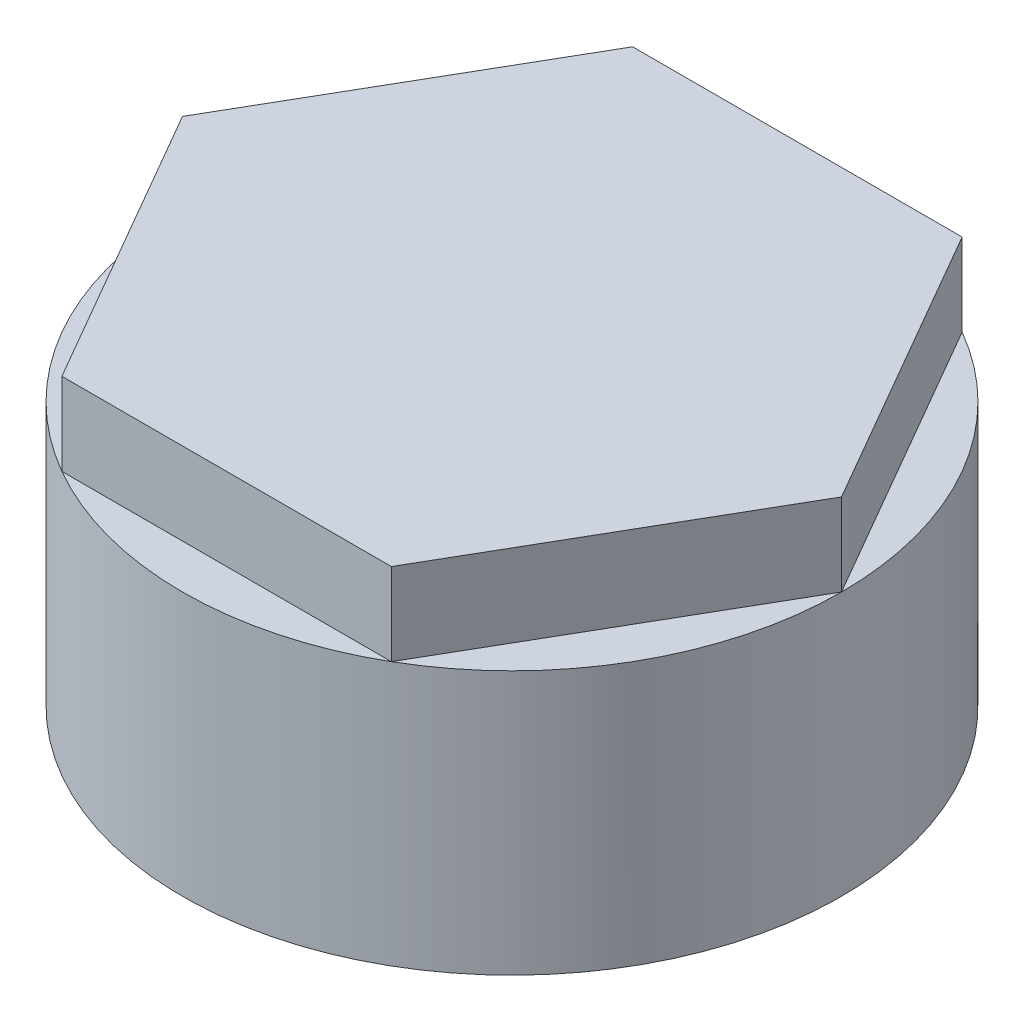
ISO-10303-21;
HEADER;
FILE_DESCRIPTION(('STEP AP214'),'2;1');
FILE_NAME('part.step','',(''),(''),'','','');
FILE_SCHEMA(('AUTOMOTIVE_DESIGN { 1 0 10303 214 1 1 1 1 }'));
ENDSEC;
DATA;
#1=APPLICATION_CONTEXT('core data for automotive mechanical design processes');
#2=APPLICATION_PROTOCOL_DEFINITION('international standard','automotive_design',2000,#1);
#3=PRODUCT_CONTEXT('',#1,'mechanical');
#4=PRODUCT('Part','Part','',(#3));
#5=PRODUCT_RELATED_PRODUCT_CATEGORY('part','',(#4));
#6=PRODUCT_DEFINITION_FORMATION('','',#4);
#7=PRODUCT_DEFINITION_CONTEXT('part definition',#1,'design');
#8=PRODUCT_DEFINITION('design','',#6,#7);
#9=PRODUCT_DEFINITION_SHAPE('','',#8);
#10=(LENGTH_UNIT() NAMED_UNIT(*) SI_UNIT(.MILLI.,.METRE.));
#11=(NAMED_UNIT(*) PLANE_ANGLE_UNIT() SI_UNIT($,.RADIAN.));
#12=(NAMED_UNIT(*) SI_UNIT($,.STERADIAN.) SOLID_ANGLE_UNIT());
#13=UNCERTAINTY_MEASURE_WITH_UNIT(LENGTH_MEASURE(1.E-05),#10,'distance_accuracy_value','');
#14=(GEOMETRIC_REPRESENTATION_CONTEXT(3) GLOBAL_UNCERTAINTY_ASSIGNED_CONTEXT((#13)) GLOBAL_UNIT_ASSIGNED_CONTEXT((#10,
#11,#12)) REPRESENTATION_CONTEXT('',''));
#15=CARTESIAN_POINT('',(0.,0.,0.));
#16=DIRECTION('',(0.,0.,1.));
#17=DIRECTION('',(1.,0.,0.));
#18=AXIS2_PLACEMENT_3D('',#15,#16,#17);
#19=CARTESIAN_POINT('',(0.,0.,0.));
#20=DIRECTION('',(0.,-1.,0.));
#21=DIRECTION('',(0.,0.,-1.));
#22=AXIS2_PLACEMENT_3D('',#19,#20,#21);
#23=CYLINDRICAL_SURFACE('',#22,20.);
#24=CARTESIAN_POINT('',(0.,0.,0.));
#25=DIRECTION('',(0.,-1.,0.));
#26=DIRECTION('',(0.,0.,-1.));
#27=AXIS2_PLACEMENT_3D('',#24,#25,#26);
#28=CIRCLE('',#27,20.);
#29=CARTESIAN_POINT('',(0.,0.,-20.));
#30=VERTEX_POINT('',#29);
#31=EDGE_CURVE('E128',#30,#30,#28,.T.);
#32=ORIENTED_EDGE('',*,*,#31,.F.);
#33=EDGE_LOOP('',(#32));
#34=FACE_BOUND('',#33,.T.);
#35=CARTESIAN_POINT('',(0.,16.,0.));
#36=DIRECTION('',(0.,1.,0.));
#37=DIRECTION('',(0.,0.,1.));
#38=AXIS2_PLACEMENT_3D('',#35,#36,#37);
#39=CIRCLE('',#38,20.);
#40=CARTESIAN_POINT('',(10.,16.,-17.3205080756888));
#41=VERTEX_POINT('',#40);
#42=CARTESIAN_POINT('',(-10.,16.,-17.3205080756888));
#43=VERTEX_POINT('',#42);
#44=EDGE_CURVE('E94',#41,#43,#39,.T.);
#45=ORIENTED_EDGE('',*,*,#44,.F.);
#46=CARTESIAN_POINT('',(0.,16.,0.));
#47=DIRECTION('',(0.,1.,0.));
#48=DIRECTION('',(0.,0.,1.));
#49=AXIS2_PLACEMENT_3D('',#46,#47,#48);
#50=CIRCLE('',#49,20.);
#51=CARTESIAN_POINT('',(20.,16.,0.));
#52=VERTEX_POINT('',#51);
#53=EDGE_CURVE('E331',#52,#41,#50,.T.);
#54=ORIENTED_EDGE('',*,*,#53,.F.);
#55=CARTESIAN_POINT('',(0.,16.,0.));
#56=DIRECTION('',(0.,1.,0.));
#57=DIRECTION('',(0.,0.,1.));
#58=AXIS2_PLACEMENT_3D('',#55,#56,#57);
#59=CIRCLE('',#58,20.);
#60=CARTESIAN_POINT('',(10.,16.,17.3205080756888));
#61=VERTEX_POINT('',#60);
#62=EDGE_CURVE('E325',#61,#52,#59,.T.);
#63=ORIENTED_EDGE('',*,*,#62,.F.);
#64=CARTESIAN_POINT('',(0.,16.,0.));
#65=DIRECTION('',(0.,1.,0.));
#66=DIRECTION('',(0.,0.,1.));
#67=AXIS2_PLACEMENT_3D('',#64,#65,#66);
#68=CIRCLE('',#67,20.);
#69=CARTESIAN_POINT('',(-10.,16.,17.3205080756888));
#70=VERTEX_POINT('',#69);
#71=EDGE_CURVE('E140',#70,#61,#68,.T.);
#72=ORIENTED_EDGE('',*,*,#71,.F.);
#73=CARTESIAN_POINT('',(0.,16.,0.));
#74=DIRECTION('',(0.,1.,0.));
#75=DIRECTION('',(0.,0.,1.));
#76=AXIS2_PLACEMENT_3D('',#73,#74,#75);
#77=CIRCLE('',#76,20.);
#78=CARTESIAN_POINT('',(-20.,16.,0.));
#79=VERTEX_POINT('',#78);
#80=EDGE_CURVE('E132',#79,#70,#77,.T.);
#81=ORIENTED_EDGE('',*,*,#80,.F.);
#82=CARTESIAN_POINT('',(0.,16.,0.));
#83=DIRECTION('',(0.,1.,0.));
#84=DIRECTION('',(0.,0.,1.));
#85=AXIS2_PLACEMENT_3D('',#82,#83,#84);
#86=CIRCLE('',#85,20.);
#87=EDGE_CURVE('E119',#43,#79,#86,.T.);
#88=ORIENTED_EDGE('',*,*,#87,.F.);
#89=EDGE_LOOP('',(#45,#54,#63,#72,#81,#88));
#90=FACE_BOUND('',#89,.T.);
#91=ADVANCED_FACE('F41',(#34,#90),#23,.T.);
#92=CARTESIAN_POINT('',(-20.,0.,0.));
#93=DIRECTION('',(0.,1.,0.));
#94=DIRECTION('',(0.,0.,1.));
#95=AXIS2_PLACEMENT_3D('',#92,#93,#94);
#96=PLANE('',#95);
#97=CARTESIAN_POINT('',(0.,0.,0.));
#98=DIRECTION('',(0.,-1.,0.));
#99=DIRECTION('',(0.,0.,-1.));
#100=AXIS2_PLACEMENT_3D('',#97,#98,#99);
#101=CIRCLE('',#100,15.5465);
#102=CARTESIAN_POINT('',(0.,0.,-15.5465));
#103=VERTEX_POINT('',#102);
#104=EDGE_CURVE('E11',#103,#103,#101,.T.);
#105=ORIENTED_EDGE('',*,*,#104,.F.);
#106=EDGE_LOOP('',(#105));
#107=FACE_BOUND('',#106,.T.);
#108=ORIENTED_EDGE('',*,*,#31,.T.);
#109=EDGE_LOOP('',(#108));
#110=FACE_BOUND('',#109,.T.);
#111=ADVANCED_FACE('F43',(#107,#110),#96,.F.);
#112=CARTESIAN_POINT('',(0.,0.,0.));
#113=DIRECTION('',(0.,-1.,0.));
#114=DIRECTION('',(0.,0.,-1.));
#115=AXIS2_PLACEMENT_3D('',#112,#113,#114);
#116=CYLINDRICAL_SURFACE('',#115,15.5465);
#117=CARTESIAN_POINT('',(0.,15.,0.));
#118=DIRECTION('',(0.,-1.,0.));
#119=DIRECTION('',(0.,0.,-1.));
#120=AXIS2_PLACEMENT_3D('',#117,#118,#119);
#121=CIRCLE('',#120,15.5465);
#122=CARTESIAN_POINT('',(0.,15.,-15.5465));
#123=VERTEX_POINT('',#122);
#124=EDGE_CURVE('E49',#123,#123,#121,.T.);
#125=ORIENTED_EDGE('',*,*,#124,.F.);
#126=EDGE_LOOP('',(#125));
#127=FACE_BOUND('',#126,.T.);
#128=ORIENTED_EDGE('',*,*,#104,.T.);
#129=EDGE_LOOP('',(#128));
#130=FACE_BOUND('',#129,.T.);
#131=ADVANCED_FACE('F157',(#127,#130),#116,.F.);
#132=CARTESIAN_POINT('',(-15.5465,15.,0.));
#133=DIRECTION('',(0.,1.,0.));
#134=DIRECTION('',(0.,0.,1.));
#135=AXIS2_PLACEMENT_3D('',#132,#133,#134);
#136=PLANE('',#135);
#137=ORIENTED_EDGE('',*,*,#124,.T.);
#138=EDGE_LOOP('',(#137));
#139=FACE_BOUND('',#138,.T.);
#140=ADVANCED_FACE('F155',(#139),#136,.F.);
#141=CARTESIAN_POINT('',(0.,21.,0.));
#142=DIRECTION('',(0.,-1.,0.));
#143=DIRECTION('',(0.,0.,-1.));
#144=AXIS2_PLACEMENT_3D('',#141,#142,#143);
#145=PLANE('',#144);
#146=DIRECTION('',(0.5,0.,0.866025403784439));
#147=VECTOR('',#146,1.);
#148=CARTESIAN_POINT('',(15.,21.,-8.66025403784439));
#149=LINE('',#148,#147);
#150=CARTESIAN_POINT('',(10.,21.,-17.3205080756888));
#151=VERTEX_POINT('',#150);
#152=CARTESIAN_POINT('',(20.,21.,0.));
#153=VERTEX_POINT('',#152);
#154=EDGE_CURVE('E336',#151,#153,#149,.T.);
#155=ORIENTED_EDGE('',*,*,#154,.F.);
#156=DIRECTION('',(1.,0.,0.));
#157=VECTOR('',#156,1.);
#158=CARTESIAN_POINT('',(0.,21.,-17.3205080756888));
#159=LINE('',#158,#157);
#160=CARTESIAN_POINT('',(-10.,21.,-17.3205080756888));
#161=VERTEX_POINT('',#160);
#162=EDGE_CURVE('E102',#161,#151,#159,.T.);
#163=ORIENTED_EDGE('',*,*,#162,.F.);
#164=DIRECTION('',(0.5,0.,-0.866025403784439));
#165=VECTOR('',#164,1.);
#166=CARTESIAN_POINT('',(-15.,21.,-8.66025403784439));
#167=LINE('',#166,#165);
#168=CARTESIAN_POINT('',(-20.,21.,0.));
#169=VERTEX_POINT('',#168);
#170=EDGE_CURVE('E127',#169,#161,#167,.T.);
#171=ORIENTED_EDGE('',*,*,#170,.F.);
#172=DIRECTION('',(-0.5,0.,-0.866025403784439));
#173=VECTOR('',#172,1.);
#174=CARTESIAN_POINT('',(-15.,21.,8.66025403784439));
#175=LINE('',#174,#173);
#176=CARTESIAN_POINT('',(-10.,21.,17.3205080756888));
#177=VERTEX_POINT('',#176);
#178=EDGE_CURVE('E338',#177,#169,#175,.T.);
#179=ORIENTED_EDGE('',*,*,#178,.F.);
#180=DIRECTION('',(-1.,0.,0.));
#181=VECTOR('',#180,1.);
#182=CARTESIAN_POINT('',(0.,21.,17.3205080756888));
#183=LINE('',#182,#181);
#184=CARTESIAN_POINT('',(10.,21.,17.3205080756888));
#185=VERTEX_POINT('',#184);
#186=EDGE_CURVE('E144',#185,#177,#183,.T.);
#187=ORIENTED_EDGE('',*,*,#186,.F.);
#188=DIRECTION('',(-0.5,0.,0.866025403784439));
#189=VECTOR('',#188,1.);
#190=CARTESIAN_POINT('',(15.,21.,8.66025403784439));
#191=LINE('',#190,#189);
#192=EDGE_CURVE('E112',#153,#185,#191,.T.);
#193=ORIENTED_EDGE('',*,*,#192,.F.);
#194=EDGE_LOOP('',(#155,#163,#171,#179,#187,#193));
#195=FACE_BOUND('',#194,.T.);
#196=ADVANCED_FACE('F174',(#195),#145,.F.);
#197=CARTESIAN_POINT('',(-15.,16.,-8.66025403784439));
#198=DIRECTION('',(0.866025403784439,0.,0.5));
#199=DIRECTION('',(0.5,0.,-0.866025403784439));
#200=AXIS2_PLACEMENT_3D('',#197,#198,#199);
#201=PLANE('',#200);
#202=ORIENTED_EDGE('',*,*,#170,.T.);
#203=DIRECTION('',(0.,1.,0.));
#204=VECTOR('',#203,1.);
#205=CARTESIAN_POINT('',(-10.,16.,-17.3205080756888));
#206=LINE('',#205,#204);
#207=EDGE_CURVE('E108',#43,#161,#206,.T.);
#208=ORIENTED_EDGE('',*,*,#207,.F.);
#209=DIRECTION('',(0.5,0.,-0.866025403784439));
#210=VECTOR('',#209,1.);
#211=CARTESIAN_POINT('',(-15.,16.,-8.66025403784439));
#212=LINE('',#211,#210);
#213=EDGE_CURVE('E117',#79,#43,#212,.T.);
#214=ORIENTED_EDGE('',*,*,#213,.F.);
#215=DIRECTION('',(0.,1.,0.));
#216=VECTOR('',#215,1.);
#217=CARTESIAN_POINT('',(-20.,16.,0.));
#218=LINE('',#217,#216);
#219=EDGE_CURVE('E122',#79,#169,#218,.T.);
#220=ORIENTED_EDGE('',*,*,#219,.T.);
#221=EDGE_LOOP('',(#202,#208,#214,#220));
#222=FACE_BOUND('',#221,.T.);
#223=ADVANCED_FACE('F125',(#222),#201,.F.);
#224=CARTESIAN_POINT('',(0.,16.,0.));
#225=DIRECTION('',(0.,1.,0.));
#226=DIRECTION('',(0.,0.,1.));
#227=AXIS2_PLACEMENT_3D('',#224,#225,#226);
#228=PLANE('',#227);
#229=ORIENTED_EDGE('',*,*,#87,.T.);
#230=ORIENTED_EDGE('',*,*,#213,.T.);
#231=EDGE_LOOP('',(#229,#230));
#232=FACE_BOUND('',#231,.T.);
#233=ADVANCED_FACE('F118',(#232),#228,.T.);
#234=CARTESIAN_POINT('',(0.,16.,17.3205080756888));
#235=DIRECTION('',(0.,0.,-1.));
#236=DIRECTION('',(-1.,0.,0.));
#237=AXIS2_PLACEMENT_3D('',#234,#235,#236);
#238=PLANE('',#237);
#239=ORIENTED_EDGE('',*,*,#186,.T.);
#240=DIRECTION('',(0.,1.,0.));
#241=VECTOR('',#240,1.);
#242=CARTESIAN_POINT('',(-10.,16.,17.3205080756888));
#243=LINE('',#242,#241);
#244=EDGE_CURVE('E341',#70,#177,#243,.T.);
#245=ORIENTED_EDGE('',*,*,#244,.F.);
#246=DIRECTION('',(-1.,0.,0.));
#247=VECTOR('',#246,1.);
#248=CARTESIAN_POINT('',(0.,16.,17.3205080756888));
#249=LINE('',#248,#247);
#250=EDGE_CURVE('E143',#61,#70,#249,.T.);
#251=ORIENTED_EDGE('',*,*,#250,.F.);
#252=DIRECTION('',(0.,1.,0.));
#253=VECTOR('',#252,1.);
#254=CARTESIAN_POINT('',(10.,16.,17.3205080756888));
#255=LINE('',#254,#253);
#256=EDGE_CURVE('E134',#61,#185,#255,.T.);
#257=ORIENTED_EDGE('',*,*,#256,.T.);
#258=EDGE_LOOP('',(#239,#245,#251,#257));
#259=FACE_BOUND('',#258,.T.);
#260=ADVANCED_FACE('F172',(#259),#238,.F.);
#261=CARTESIAN_POINT('',(0.,16.,0.));
#262=DIRECTION('',(0.,1.,0.));
#263=DIRECTION('',(0.,0.,1.));
#264=AXIS2_PLACEMENT_3D('',#261,#262,#263);
#265=PLANE('',#264);
#266=ORIENTED_EDGE('',*,*,#71,.T.);
#267=ORIENTED_EDGE('',*,*,#250,.T.);
#268=EDGE_LOOP('',(#266,#267));
#269=FACE_BOUND('',#268,.T.);
#270=ADVANCED_FACE('F206',(#269),#265,.T.);
#271=CARTESIAN_POINT('',(15.,16.,-8.66025403784439));
#272=DIRECTION('',(-0.866025403784439,0.,0.5));
#273=DIRECTION('',(0.5,0.,0.866025403784439));
#274=AXIS2_PLACEMENT_3D('',#271,#272,#273);
#275=PLANE('',#274);
#276=ORIENTED_EDGE('',*,*,#154,.T.);
#277=DIRECTION('',(0.,1.,0.));
#278=VECTOR('',#277,1.);
#279=CARTESIAN_POINT('',(20.,16.,0.));
#280=LINE('',#279,#278);
#281=EDGE_CURVE('E334',#52,#153,#280,.T.);
#282=ORIENTED_EDGE('',*,*,#281,.F.);
#283=DIRECTION('',(0.5,0.,0.866025403784439));
#284=VECTOR('',#283,1.);
#285=CARTESIAN_POINT('',(15.,16.,-8.66025403784439));
#286=LINE('',#285,#284);
#287=EDGE_CURVE('E329',#41,#52,#286,.T.);
#288=ORIENTED_EDGE('',*,*,#287,.F.);
#289=DIRECTION('',(0.,1.,0.));
#290=VECTOR('',#289,1.);
#291=CARTESIAN_POINT('',(10.,16.,-17.3205080756888));
#292=LINE('',#291,#290);
#293=EDGE_CURVE('E111',#41,#151,#292,.T.);
#294=ORIENTED_EDGE('',*,*,#293,.T.);
#295=EDGE_LOOP('',(#276,#282,#288,#294));
#296=FACE_BOUND('',#295,.T.);
#297=ADVANCED_FACE('F213',(#296),#275,.F.);
#298=CARTESIAN_POINT('',(0.,16.,0.));
#299=DIRECTION('',(0.,1.,0.));
#300=DIRECTION('',(0.,0.,1.));
#301=AXIS2_PLACEMENT_3D('',#298,#299,#300);
#302=PLANE('',#301);
#303=ORIENTED_EDGE('',*,*,#53,.T.);
#304=ORIENTED_EDGE('',*,*,#287,.T.);
#305=EDGE_LOOP('',(#303,#304));
#306=FACE_BOUND('',#305,.T.);
#307=ADVANCED_FACE('F220',(#306),#302,.T.);
#308=CARTESIAN_POINT('',(-15.,16.,8.66025403784439));
#309=DIRECTION('',(0.866025403784439,0.,-0.5));
#310=DIRECTION('',(-0.5,0.,-0.866025403784439));
#311=AXIS2_PLACEMENT_3D('',#308,#309,#310);
#312=PLANE('',#311);
#313=ORIENTED_EDGE('',*,*,#178,.T.);
#314=ORIENTED_EDGE('',*,*,#219,.F.);
#315=DIRECTION('',(-0.5,0.,-0.866025403784439));
#316=VECTOR('',#315,1.);
#317=CARTESIAN_POINT('',(-15.,16.,8.66025403784439));
#318=LINE('',#317,#316);
#319=EDGE_CURVE('E64',#70,#79,#318,.T.);
#320=ORIENTED_EDGE('',*,*,#319,.F.);
#321=ORIENTED_EDGE('',*,*,#244,.T.);
#322=EDGE_LOOP('',(#313,#314,#320,#321));
#323=FACE_BOUND('',#322,.T.);
#324=ADVANCED_FACE('F228',(#323),#312,.F.);
#325=CARTESIAN_POINT('',(0.,16.,0.));
#326=DIRECTION('',(0.,1.,0.));
#327=DIRECTION('',(0.,0.,1.));
#328=AXIS2_PLACEMENT_3D('',#325,#326,#327);
#329=PLANE('',#328);
#330=ORIENTED_EDGE('',*,*,#80,.T.);
#331=ORIENTED_EDGE('',*,*,#319,.T.);
#332=EDGE_LOOP('',(#330,#331));
#333=FACE_BOUND('',#332,.T.);
#334=ADVANCED_FACE('F236',(#333),#329,.T.);
#335=CARTESIAN_POINT('',(15.,16.,8.66025403784439));
#336=DIRECTION('',(-0.866025403784439,0.,-0.5));
#337=DIRECTION('',(-0.5,0.,0.866025403784439));
#338=AXIS2_PLACEMENT_3D('',#335,#336,#337);
#339=PLANE('',#338);
#340=ORIENTED_EDGE('',*,*,#192,.T.);
#341=ORIENTED_EDGE('',*,*,#256,.F.);
#342=DIRECTION('',(-0.5,0.,0.866025403784439));
#343=VECTOR('',#342,1.);
#344=CARTESIAN_POINT('',(15.,16.,8.66025403784439));
#345=LINE('',#344,#343);
#346=EDGE_CURVE('E56',#52,#61,#345,.T.);
#347=ORIENTED_EDGE('',*,*,#346,.F.);
#348=ORIENTED_EDGE('',*,*,#281,.T.);
#349=EDGE_LOOP('',(#340,#341,#347,#348));
#350=FACE_BOUND('',#349,.T.);
#351=ADVANCED_FACE('F243',(#350),#339,.F.);
#352=CARTESIAN_POINT('',(0.,16.,0.));
#353=DIRECTION('',(0.,1.,0.));
#354=DIRECTION('',(0.,0.,1.));
#355=AXIS2_PLACEMENT_3D('',#352,#353,#354);
#356=PLANE('',#355);
#357=ORIENTED_EDGE('',*,*,#62,.T.);
#358=ORIENTED_EDGE('',*,*,#346,.T.);
#359=EDGE_LOOP('',(#357,#358));
#360=FACE_BOUND('',#359,.T.);
#361=ADVANCED_FACE('F251',(#360),#356,.T.);
#362=CARTESIAN_POINT('',(0.,16.,-17.3205080756888));
#363=DIRECTION('',(0.,0.,1.));
#364=DIRECTION('',(1.,0.,0.));
#365=AXIS2_PLACEMENT_3D('',#362,#363,#364);
#366=PLANE('',#365);
#367=ORIENTED_EDGE('',*,*,#162,.T.);
#368=ORIENTED_EDGE('',*,*,#293,.F.);
#369=DIRECTION('',(1.,0.,0.));
#370=VECTOR('',#369,1.);
#371=CARTESIAN_POINT('',(0.,16.,-17.3205080756888));
#372=LINE('',#371,#370);
#373=EDGE_CURVE('E97',#43,#41,#372,.T.);
#374=ORIENTED_EDGE('',*,*,#373,.F.);
#375=ORIENTED_EDGE('',*,*,#207,.T.);
#376=EDGE_LOOP('',(#367,#368,#374,#375));
#377=FACE_BOUND('',#376,.T.);
#378=ADVANCED_FACE('F106',(#377),#366,.F.);
#379=CARTESIAN_POINT('',(0.,16.,0.));
#380=DIRECTION('',(0.,1.,0.));
#381=DIRECTION('',(0.,0.,1.));
#382=AXIS2_PLACEMENT_3D('',#379,#380,#381);
#383=PLANE('',#382);
#384=ORIENTED_EDGE('',*,*,#44,.T.);
#385=ORIENTED_EDGE('',*,*,#373,.T.);
#386=EDGE_LOOP('',(#384,#385));
#387=FACE_BOUND('',#386,.T.);
#388=ADVANCED_FACE('F96',(#387),#383,.T.);
#389=CLOSED_SHELL('',(#91,#111,#131,#140,#196,#223,#233,#260,#270,#297,#307,#324,#334,#351,#361,
#378,#388));
#390=MANIFOLD_SOLID_BREP('B2',#389);
#391=ADVANCED_BREP_SHAPE_REPRESENTATION('',(#18,#390),#14);
#392=SHAPE_DEFINITION_REPRESENTATION(#9,#391);
ENDSEC;
END-ISO-10303-21;
